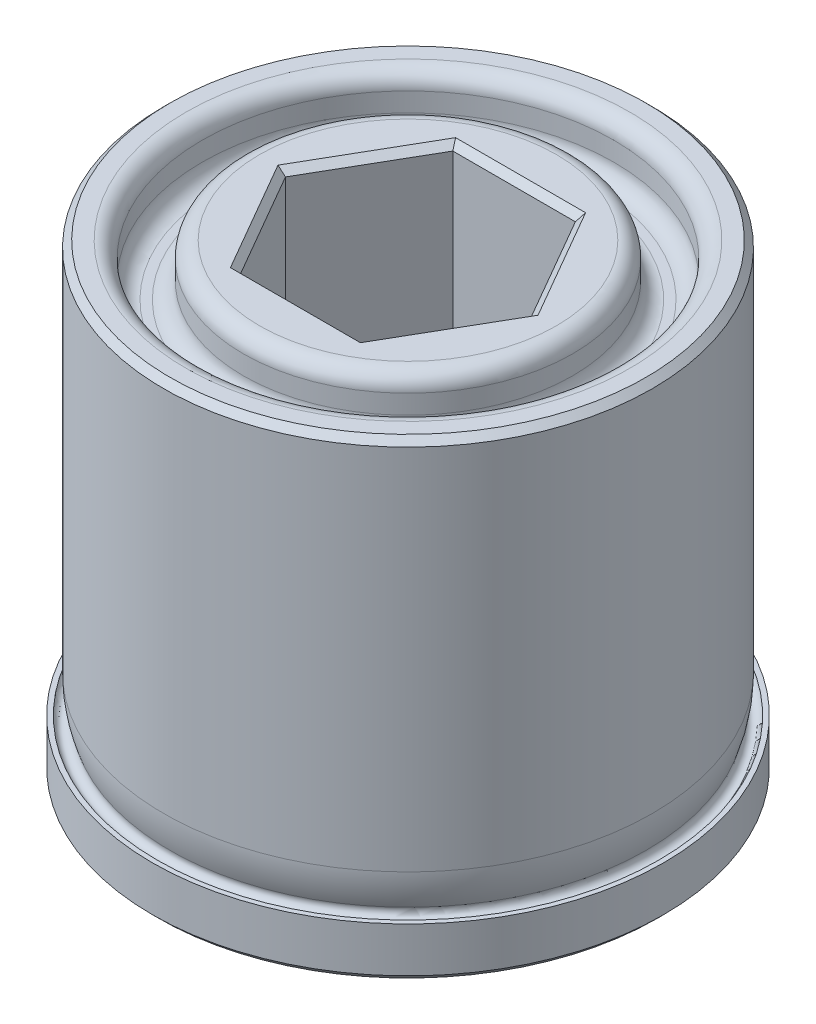
ISO-10303-21;
HEADER;
FILE_DESCRIPTION(('STEP AP214'),'2;1');
FILE_NAME('part.step','',(''),(''),'','','');
FILE_SCHEMA(('AUTOMOTIVE_DESIGN { 1 0 10303 214 1 1 1 1 }'));
ENDSEC;
DATA;
#1=APPLICATION_CONTEXT('core data for automotive mechanical design processes');
#2=APPLICATION_PROTOCOL_DEFINITION('international standard','automotive_design',2000,#1);
#3=PRODUCT_CONTEXT('',#1,'mechanical');
#4=PRODUCT('Part','Part','',(#3));
#5=PRODUCT_RELATED_PRODUCT_CATEGORY('part','',(#4));
#6=PRODUCT_DEFINITION_FORMATION('','',#4);
#7=PRODUCT_DEFINITION_CONTEXT('part definition',#1,'design');
#8=PRODUCT_DEFINITION('design','',#6,#7);
#9=PRODUCT_DEFINITION_SHAPE('','',#8);
#10=(LENGTH_UNIT() NAMED_UNIT(*) SI_UNIT(.MILLI.,.METRE.));
#11=(NAMED_UNIT(*) PLANE_ANGLE_UNIT() SI_UNIT($,.RADIAN.));
#12=(NAMED_UNIT(*) SI_UNIT($,.STERADIAN.) SOLID_ANGLE_UNIT());
#13=UNCERTAINTY_MEASURE_WITH_UNIT(LENGTH_MEASURE(1.E-05),#10,'distance_accuracy_value','');
#14=(GEOMETRIC_REPRESENTATION_CONTEXT(3) GLOBAL_UNCERTAINTY_ASSIGNED_CONTEXT((#13)) GLOBAL_UNIT_ASSIGNED_CONTEXT((#10,
#11,#12)) REPRESENTATION_CONTEXT('',''));
#15=CARTESIAN_POINT('',(0.,0.,0.));
#16=DIRECTION('',(0.,0.,1.));
#17=DIRECTION('',(1.,0.,0.));
#18=AXIS2_PLACEMENT_3D('',#15,#16,#17);
#19=CARTESIAN_POINT('',(0.,25.4,0.));
#20=DIRECTION('',(0.,1.,0.));
#21=DIRECTION('',(-1.,0.,0.));
#22=AXIS2_PLACEMENT_3D('',#19,#20,#21);
#23=PLANE('',#22);
#24=CARTESIAN_POINT('',(0.,25.4,0.));
#25=DIRECTION('',(0.,1.,0.));
#26=DIRECTION('',(-1.,0.,0.));
#27=AXIS2_PLACEMENT_3D('',#24,#25,#26);
#28=CIRCLE('',#27,9.16);
#29=CARTESIAN_POINT('',(-9.16,25.4,0.));
#30=VERTEX_POINT('',#29);
#31=EDGE_CURVE('E268',#30,#30,#28,.T.);
#32=ORIENTED_EDGE('',*,*,#31,.T.);
#33=EDGE_LOOP('',(#32));
#34=FACE_BOUND('',#33,.T.);
#35=DIRECTION('',(1.,0.,0.));
#36=VECTOR('',#35,1.);
#37=CARTESIAN_POINT('',(3.78164426319204,25.4,-6.95));
#38=LINE('',#37,#36);
#39=CARTESIAN_POINT('',(-4.0125843708679,25.4,-6.95));
#40=VERTEX_POINT('',#39);
#41=CARTESIAN_POINT('',(4.01258437086789,25.4,-6.95));
#42=VERTEX_POINT('',#41);
#43=EDGE_CURVE('E218',#40,#42,#38,.T.);
#44=ORIENTED_EDGE('',*,*,#43,.T.);
#45=DIRECTION('',(0.5,0.,0.866025403784439));
#46=VECTOR('',#45,1.);
#47=CARTESIAN_POINT('',(7.90969868789787,25.4,-0.200000000000005));
#48=LINE('',#47,#46);
#49=CARTESIAN_POINT('',(8.02516874173579,25.4,0.));
#50=VERTEX_POINT('',#49);
#51=EDGE_CURVE('E227',#42,#50,#48,.T.);
#52=ORIENTED_EDGE('',*,*,#51,.T.);
#53=DIRECTION('',(-0.5,0.,0.866025403784439));
#54=VECTOR('',#53,1.);
#55=CARTESIAN_POINT('',(4.12805442470582,25.4,6.75));
#56=LINE('',#55,#54);
#57=CARTESIAN_POINT('',(4.01258437086789,25.4,6.95));
#58=VERTEX_POINT('',#57);
#59=EDGE_CURVE('E55',#50,#58,#56,.T.);
#60=ORIENTED_EDGE('',*,*,#59,.T.);
#61=DIRECTION('',(-1.,0.,0.));
#62=VECTOR('',#61,1.);
#63=CARTESIAN_POINT('',(-3.78164426319205,25.4,6.95));
#64=LINE('',#63,#62);
#65=CARTESIAN_POINT('',(-4.0125843708679,25.4,6.95));
#66=VERTEX_POINT('',#65);
#67=EDGE_CURVE('E224',#58,#66,#64,.T.);
#68=ORIENTED_EDGE('',*,*,#67,.T.);
#69=DIRECTION('',(-0.5,0.,-0.866025403784439));
#70=VECTOR('',#69,1.);
#71=CARTESIAN_POINT('',(-7.90969868789788,25.4,0.200000000000001));
#72=LINE('',#71,#70);
#73=CARTESIAN_POINT('',(-8.0251687417358,25.4,0.));
#74=VERTEX_POINT('',#73);
#75=EDGE_CURVE('E222',#66,#74,#72,.T.);
#76=ORIENTED_EDGE('',*,*,#75,.T.);
#77=DIRECTION('',(0.5,0.,-0.866025403784439));
#78=VECTOR('',#77,1.);
#79=CARTESIAN_POINT('',(-4.12805442470583,25.4,-6.75));
#80=LINE('',#79,#78);
#81=EDGE_CURVE('E220',#74,#40,#80,.T.);
#82=ORIENTED_EDGE('',*,*,#81,.T.);
#83=EDGE_LOOP('',(#44,#52,#60,#68,#76,#82));
#84=FACE_BOUND('',#83,.T.);
#85=ADVANCED_FACE('F33',(#34,#84),#23,.T.);
#86=CARTESIAN_POINT('',(0.,-3.175,0.));
#87=DIRECTION('',(0.,-1.,0.));
#88=DIRECTION('',(1.,0.,0.));
#89=AXIS2_PLACEMENT_3D('',#86,#87,#88);
#90=PLANE('',#89);
#91=CARTESIAN_POINT('',(0.,-3.175,0.));
#92=DIRECTION('',(0.,-1.,0.));
#93=DIRECTION('',(1.,0.,0.));
#94=AXIS2_PLACEMENT_3D('',#91,#92,#93);
#95=CIRCLE('',#94,15.375);
#96=CARTESIAN_POINT('',(15.375,-3.175,0.));
#97=VERTEX_POINT('',#96);
#98=EDGE_CURVE('E228',#97,#97,#95,.T.);
#99=ORIENTED_EDGE('',*,*,#98,.T.);
#100=EDGE_LOOP('',(#99));
#101=FACE_BOUND('',#100,.T.);
#102=DIRECTION('',(1.,0.,0.));
#103=VECTOR('',#102,1.);
#104=CARTESIAN_POINT('',(3.78164426319205,-3.175,6.95000000000001));
#105=LINE('',#104,#103);
#106=CARTESIAN_POINT('',(-4.0125843708679,-3.175,6.95000000000001));
#107=VERTEX_POINT('',#106);
#108=CARTESIAN_POINT('',(4.0125843708679,-3.175,6.95000000000001));
#109=VERTEX_POINT('',#108);
#110=EDGE_CURVE('E198',#107,#109,#105,.T.);
#111=ORIENTED_EDGE('',*,*,#110,.T.);
#112=DIRECTION('',(0.5,0.,-0.866025403784439));
#113=VECTOR('',#112,1.);
#114=CARTESIAN_POINT('',(7.90969868789788,-3.175,0.199999999999997));
#115=LINE('',#114,#113);
#116=CARTESIAN_POINT('',(8.0251687417358,-3.175,0.));
#117=VERTEX_POINT('',#116);
#118=EDGE_CURVE('E131',#109,#117,#115,.T.);
#119=ORIENTED_EDGE('',*,*,#118,.T.);
#120=DIRECTION('',(-0.5,0.,-0.866025403784439));
#121=VECTOR('',#120,1.);
#122=CARTESIAN_POINT('',(4.12805442470583,-3.175,-6.75));
#123=LINE('',#122,#121);
#124=CARTESIAN_POINT('',(4.0125843708679,-3.175,-6.95000000000001));
#125=VERTEX_POINT('',#124);
#126=EDGE_CURVE('E192',#117,#125,#123,.T.);
#127=ORIENTED_EDGE('',*,*,#126,.T.);
#128=DIRECTION('',(-1.,0.,0.));
#129=VECTOR('',#128,1.);
#130=CARTESIAN_POINT('',(-3.78164426319205,-3.175,-6.95000000000001));
#131=LINE('',#130,#129);
#132=CARTESIAN_POINT('',(-4.0125843708679,-3.175,-6.95000000000001));
#133=VERTEX_POINT('',#132);
#134=EDGE_CURVE('E158',#125,#133,#131,.T.);
#135=ORIENTED_EDGE('',*,*,#134,.T.);
#136=DIRECTION('',(-0.5,0.,0.866025403784439));
#137=VECTOR('',#136,1.);
#138=CARTESIAN_POINT('',(-7.90969868789788,-3.175,-0.200000000000001));
#139=LINE('',#138,#137);
#140=CARTESIAN_POINT('',(-8.0251687417358,-3.175,0.));
#141=VERTEX_POINT('',#140);
#142=EDGE_CURVE('E194',#133,#141,#139,.T.);
#143=ORIENTED_EDGE('',*,*,#142,.T.);
#144=DIRECTION('',(0.5,0.,0.866025403784439));
#145=VECTOR('',#144,1.);
#146=CARTESIAN_POINT('',(-4.12805442470583,-3.175,6.75));
#147=LINE('',#146,#145);
#148=EDGE_CURVE('E196',#141,#107,#147,.T.);
#149=ORIENTED_EDGE('',*,*,#148,.T.);
#150=EDGE_LOOP('',(#111,#119,#127,#135,#143,#149));
#151=FACE_BOUND('',#150,.T.);
#152=ADVANCED_FACE('F298',(#101,#151),#90,.T.);
#153=CARTESIAN_POINT('',(0.,0.,0.));
#154=DIRECTION('',(0.,-1.,0.));
#155=DIRECTION('',(1.,0.,0.));
#156=AXIS2_PLACEMENT_3D('',#153,#154,#155);
#157=CYLINDRICAL_SURFACE('',#156,15.775);
#158=CARTESIAN_POINT('',(0.,-2.77499999999999,0.));
#159=DIRECTION('',(0.,-1.,0.));
#160=DIRECTION('',(1.,0.,0.));
#161=AXIS2_PLACEMENT_3D('',#158,#159,#160);
#162=CIRCLE('',#161,15.775);
#163=CARTESIAN_POINT('',(15.775,-2.77499999999999,0.));
#164=VERTEX_POINT('',#163);
#165=EDGE_CURVE('E256',#164,#164,#162,.F.);
#166=ORIENTED_EDGE('',*,*,#165,.T.);
#167=EDGE_LOOP('',(#166));
#168=FACE_BOUND('',#167,.T.);
#169=CARTESIAN_POINT('',(0.,0.,0.));
#170=DIRECTION('',(0.,-1.,0.));
#171=DIRECTION('',(1.,0.,0.));
#172=AXIS2_PLACEMENT_3D('',#169,#170,#171);
#173=CIRCLE('',#172,15.775);
#174=CARTESIAN_POINT('',(15.775,0.,0.));
#175=VERTEX_POINT('',#174);
#176=EDGE_CURVE('E167',#175,#175,#173,.T.);
#177=ORIENTED_EDGE('',*,*,#176,.T.);
#178=EDGE_LOOP('',(#177));
#179=FACE_BOUND('',#178,.T.);
#180=ADVANCED_FACE('F305',(#168,#179),#157,.T.);
#181=CARTESIAN_POINT('',(15.481250054,0.,0.));
#182=DIRECTION('',(0.,1.,0.));
#183=DIRECTION('',(-1.,0.,0.));
#184=AXIS2_PLACEMENT_3D('',#181,#182,#183);
#185=PLANE('',#184);
#186=CARTESIAN_POINT('',(0.,0.,0.));
#187=DIRECTION('',(0.,-1.,0.));
#188=DIRECTION('',(1.,0.,0.));
#189=AXIS2_PLACEMENT_3D('',#186,#187,#188);
#190=CIRCLE('',#189,15.481250054);
#191=CARTESIAN_POINT('',(15.481250054,0.,0.));
#192=VERTEX_POINT('',#191);
#193=EDGE_CURVE('E163',#192,#192,#190,.T.);
#194=ORIENTED_EDGE('',*,*,#193,.T.);
#195=EDGE_LOOP('',(#194));
#196=FACE_BOUND('',#195,.T.);
#197=ORIENTED_EDGE('',*,*,#176,.F.);
#198=EDGE_LOOP('',(#197));
#199=FACE_BOUND('',#198,.T.);
#200=ADVANCED_FACE('F554',(#196,#199),#185,.T.);
#201=CARTESIAN_POINT('',(0.,0.,0.));
#202=DIRECTION('',(0.,-1.,0.));
#203=DIRECTION('',(1.,0.,0.));
#204=AXIS2_PLACEMENT_3D('',#201,#202,#203);
#205=TOROIDAL_SURFACE('',#204,15.081250054,0.4);
#206=CARTESIAN_POINT('',(0.,0.13565064464904,0.));
#207=DIRECTION('',(0.,-1.,0.));
#208=DIRECTION('',(1.,0.,0.));
#209=AXIS2_PLACEMENT_3D('',#206,#207,#208);
#210=CIRCLE('',#209,14.7049537577036);
#211=CARTESIAN_POINT('',(14.7049537577036,0.135650644649043,0.));
#212=VERTEX_POINT('',#211);
#213=EDGE_CURVE('E41',#212,#212,#210,.T.);
#214=ORIENTED_EDGE('',*,*,#213,.T.);
#215=EDGE_LOOP('',(#214));
#216=FACE_BOUND('',#215,.T.);
#217=ORIENTED_EDGE('',*,*,#193,.F.);
#218=EDGE_LOOP('',(#217));
#219=FACE_BOUND('',#218,.T.);
#220=ADVANCED_FACE('F285',(#216,#219),#205,.F.);
#221=CARTESIAN_POINT('',(0.,0.,0.));
#222=DIRECTION('',(0.,-1.,0.));
#223=DIRECTION('',(1.,0.,0.));
#224=AXIS2_PLACEMENT_3D('',#221,#222,#223);
#225=CYLINDRICAL_SURFACE('',#224,15.081250054);
#226=CARTESIAN_POINT('',(0.,2.28910462845201,0.));
#227=DIRECTION('',(0.,1.,0.));
#228=DIRECTION('',(-1.,0.,0.));
#229=AXIS2_PLACEMENT_3D('',#226,#227,#228);
#230=CIRCLE('',#229,15.081250054);
#231=CARTESIAN_POINT('',(-15.081250054,2.28910462845201,0.));
#232=VERTEX_POINT('',#231);
#233=EDGE_CURVE('E11',#232,#232,#230,.T.);
#234=ORIENTED_EDGE('',*,*,#233,.T.);
#235=EDGE_LOOP('',(#234));
#236=FACE_BOUND('',#235,.T.);
#237=CARTESIAN_POINT('',(0.,25.,0.));
#238=DIRECTION('',(0.,1.,0.));
#239=DIRECTION('',(-1.,0.,0.));
#240=AXIS2_PLACEMENT_3D('',#237,#238,#239);
#241=CIRCLE('',#240,15.081250054);
#242=CARTESIAN_POINT('',(-15.081250054,25.,0.));
#243=VERTEX_POINT('',#242);
#244=EDGE_CURVE('E184',#243,#243,#241,.F.);
#245=ORIENTED_EDGE('',*,*,#244,.T.);
#246=EDGE_LOOP('',(#245));
#247=FACE_BOUND('',#246,.T.);
#248=ADVANCED_FACE('F312',(#236,#247),#225,.T.);
#249=CARTESIAN_POINT('',(0.,25.4,0.));
#250=DIRECTION('',(0.,1.,0.));
#251=DIRECTION('',(-1.,0.,0.));
#252=AXIS2_PLACEMENT_3D('',#249,#250,#251);
#253=CIRCLE('',#252,13.7);
#254=CARTESIAN_POINT('',(-13.7,25.4,0.));
#255=VERTEX_POINT('',#254);
#256=EDGE_CURVE('E265',#255,#255,#253,.F.);
#257=ORIENTED_EDGE('',*,*,#256,.T.);
#258=EDGE_LOOP('',(#257));
#259=FACE_BOUND('',#258,.T.);
#260=CARTESIAN_POINT('',(0.,25.4,0.));
#261=DIRECTION('',(0.,1.,0.));
#262=DIRECTION('',(-1.,0.,0.));
#263=AXIS2_PLACEMENT_3D('',#260,#261,#262);
#264=CIRCLE('',#263,14.681250054);
#265=CARTESIAN_POINT('',(-14.681250054,25.4,0.));
#266=VERTEX_POINT('',#265);
#267=EDGE_CURVE('E187',#266,#266,#264,.T.);
#268=ORIENTED_EDGE('',*,*,#267,.T.);
#269=EDGE_LOOP('',(#268));
#270=FACE_BOUND('',#269,.T.);
#271=ADVANCED_FACE('F301',(#259,#270),#23,.T.);
#272=CARTESIAN_POINT('',(0.,25.,0.));
#273=DIRECTION('',(0.,-1.,0.));
#274=DIRECTION('',(1.,0.,0.));
#275=AXIS2_PLACEMENT_3D('',#272,#273,#274);
#276=CONICAL_SURFACE('',#275,15.081250054,0.785398163397453);
#277=ORIENTED_EDGE('',*,*,#267,.F.);
#278=EDGE_LOOP('',(#277));
#279=FACE_BOUND('',#278,.T.);
#280=ORIENTED_EDGE('',*,*,#244,.F.);
#281=EDGE_LOOP('',(#280));
#282=FACE_BOUND('',#281,.T.);
#283=ADVANCED_FACE('F311',(#279,#282),#276,.T.);
#284=CARTESIAN_POINT('',(3.78164426319205,-12.7,6.55));
#285=DIRECTION('',(0.866025403784439,0.,0.5));
#286=DIRECTION('',(0.5,0.,-0.866025403784439));
#287=AXIS2_PLACEMENT_3D('',#284,#285,#286);
#288=PLANE('',#287);
#289=DIRECTION('',(0.,1.,0.));
#290=VECTOR('',#289,1.);
#291=CARTESIAN_POINT('',(7.5632885263841,-12.7,0.));
#292=LINE('',#291,#290);
#293=CARTESIAN_POINT('',(7.5632885263841,-2.775,0.));
#294=VERTEX_POINT('',#293);
#295=CARTESIAN_POINT('',(7.56328852638409,25.,0.));
#296=VERTEX_POINT('',#295);
#297=EDGE_CURVE('E156',#294,#296,#292,.T.);
#298=ORIENTED_EDGE('',*,*,#297,.F.);
#299=DIRECTION('',(-0.5,0.,0.866025403784439));
#300=VECTOR('',#299,1.);
#301=CARTESIAN_POINT('',(3.78164426319205,-2.775,6.55));
#302=LINE('',#301,#300);
#303=CARTESIAN_POINT('',(3.78164426319205,-2.775,6.55));
#304=VERTEX_POINT('',#303);
#305=EDGE_CURVE('E129',#294,#304,#302,.T.);
#306=ORIENTED_EDGE('',*,*,#305,.T.);
#307=DIRECTION('',(0.,1.,0.));
#308=VECTOR('',#307,1.);
#309=CARTESIAN_POINT('',(3.78164426319205,-12.7,6.55));
#310=LINE('',#309,#308);
#311=CARTESIAN_POINT('',(3.78164426319204,25.,6.55));
#312=VERTEX_POINT('',#311);
#313=EDGE_CURVE('E153',#304,#312,#310,.T.);
#314=ORIENTED_EDGE('',*,*,#313,.T.);
#315=DIRECTION('',(0.5,0.,-0.866025403784439));
#316=VECTOR('',#315,1.);
#317=CARTESIAN_POINT('',(7.56328852638409,25.,0.));
#318=LINE('',#317,#316);
#319=EDGE_CURVE('E159',#312,#296,#318,.T.);
#320=ORIENTED_EDGE('',*,*,#319,.T.);
#321=EDGE_LOOP('',(#298,#306,#314,#320));
#322=FACE_BOUND('',#321,.T.);
#323=ADVANCED_FACE('F152',(#322),#288,.F.);
#324=CARTESIAN_POINT('',(-3.78164426319205,-12.7,6.55));
#325=DIRECTION('',(0.,0.,1.));
#326=DIRECTION('',(1.,0.,0.));
#327=AXIS2_PLACEMENT_3D('',#324,#325,#326);
#328=PLANE('',#327);
#329=ORIENTED_EDGE('',*,*,#313,.F.);
#330=DIRECTION('',(-1.,0.,0.));
#331=VECTOR('',#330,1.);
#332=CARTESIAN_POINT('',(-3.78164426319205,-2.775,6.55));
#333=LINE('',#332,#331);
#334=CARTESIAN_POINT('',(-3.78164426319205,-2.775,6.55));
#335=VERTEX_POINT('',#334);
#336=EDGE_CURVE('E138',#304,#335,#333,.T.);
#337=ORIENTED_EDGE('',*,*,#336,.T.);
#338=DIRECTION('',(0.,1.,0.));
#339=VECTOR('',#338,1.);
#340=CARTESIAN_POINT('',(-3.78164426319205,-12.7,6.55));
#341=LINE('',#340,#339);
#342=CARTESIAN_POINT('',(-3.78164426319205,25.,6.55));
#343=VERTEX_POINT('',#342);
#344=EDGE_CURVE('E164',#335,#343,#341,.T.);
#345=ORIENTED_EDGE('',*,*,#344,.T.);
#346=DIRECTION('',(1.,0.,0.));
#347=VECTOR('',#346,1.);
#348=CARTESIAN_POINT('',(3.78164426319204,25.,6.55));
#349=LINE('',#348,#347);
#350=EDGE_CURVE('E147',#343,#312,#349,.T.);
#351=ORIENTED_EDGE('',*,*,#350,.T.);
#352=EDGE_LOOP('',(#329,#337,#345,#351));
#353=FACE_BOUND('',#352,.T.);
#354=ADVANCED_FACE('F161',(#353),#328,.F.);
#355=CARTESIAN_POINT('',(-7.56328852638409,-12.7,0.));
#356=DIRECTION('',(-0.866025403784439,0.,0.5));
#357=DIRECTION('',(0.5,0.,0.866025403784439));
#358=AXIS2_PLACEMENT_3D('',#355,#356,#357);
#359=PLANE('',#358);
#360=ORIENTED_EDGE('',*,*,#344,.F.);
#361=DIRECTION('',(-0.5,0.,-0.866025403784439));
#362=VECTOR('',#361,1.);
#363=CARTESIAN_POINT('',(-7.5632885263841,-2.775,0.));
#364=LINE('',#363,#362);
#365=CARTESIAN_POINT('',(-7.5632885263841,-2.775,0.));
#366=VERTEX_POINT('',#365);
#367=EDGE_CURVE('E203',#335,#366,#364,.T.);
#368=ORIENTED_EDGE('',*,*,#367,.T.);
#369=DIRECTION('',(0.,1.,0.));
#370=VECTOR('',#369,1.);
#371=CARTESIAN_POINT('',(-7.56328852638409,-12.7,0.));
#372=LINE('',#371,#370);
#373=CARTESIAN_POINT('',(-7.5632885263841,25.,0.));
#374=VERTEX_POINT('',#373);
#375=EDGE_CURVE('E169',#366,#374,#372,.T.);
#376=ORIENTED_EDGE('',*,*,#375,.T.);
#377=DIRECTION('',(0.5,0.,0.866025403784439));
#378=VECTOR('',#377,1.);
#379=CARTESIAN_POINT('',(-3.78164426319205,25.,6.55));
#380=LINE('',#379,#378);
#381=EDGE_CURVE('E146',#374,#343,#380,.T.);
#382=ORIENTED_EDGE('',*,*,#381,.T.);
#383=EDGE_LOOP('',(#360,#368,#376,#382));
#384=FACE_BOUND('',#383,.T.);
#385=ADVANCED_FACE('F357',(#384),#359,.F.);
#386=CARTESIAN_POINT('',(-3.78164426319205,-12.7,-6.55));
#387=DIRECTION('',(-0.866025403784439,0.,-0.5));
#388=DIRECTION('',(-0.5,0.,0.866025403784439));
#389=AXIS2_PLACEMENT_3D('',#386,#387,#388);
#390=PLANE('',#389);
#391=ORIENTED_EDGE('',*,*,#375,.F.);
#392=DIRECTION('',(0.5,0.,-0.866025403784439));
#393=VECTOR('',#392,1.);
#394=CARTESIAN_POINT('',(-3.78164426319205,-2.775,-6.55));
#395=LINE('',#394,#393);
#396=CARTESIAN_POINT('',(-3.78164426319205,-2.775,-6.55));
#397=VERTEX_POINT('',#396);
#398=EDGE_CURVE('E207',#366,#397,#395,.T.);
#399=ORIENTED_EDGE('',*,*,#398,.T.);
#400=DIRECTION('',(0.,1.,0.));
#401=VECTOR('',#400,1.);
#402=CARTESIAN_POINT('',(-3.78164426319205,-12.7,-6.55));
#403=LINE('',#402,#401);
#404=CARTESIAN_POINT('',(-3.78164426319206,25.,-6.55));
#405=VERTEX_POINT('',#404);
#406=EDGE_CURVE('E174',#397,#405,#403,.T.);
#407=ORIENTED_EDGE('',*,*,#406,.T.);
#408=DIRECTION('',(-0.5,0.,0.866025403784439));
#409=VECTOR('',#408,1.);
#410=CARTESIAN_POINT('',(-7.5632885263841,25.,0.));
#411=LINE('',#410,#409);
#412=EDGE_CURVE('E205',#405,#374,#411,.T.);
#413=ORIENTED_EDGE('',*,*,#412,.T.);
#414=EDGE_LOOP('',(#391,#399,#407,#413));
#415=FACE_BOUND('',#414,.T.);
#416=ADVANCED_FACE('F360',(#415),#390,.F.);
#417=CARTESIAN_POINT('',(3.78164426319205,-12.7,-6.55));
#418=DIRECTION('',(0.,0.,-1.));
#419=DIRECTION('',(-1.,0.,0.));
#420=AXIS2_PLACEMENT_3D('',#417,#418,#419);
#421=PLANE('',#420);
#422=ORIENTED_EDGE('',*,*,#406,.F.);
#423=DIRECTION('',(1.,0.,0.));
#424=VECTOR('',#423,1.);
#425=CARTESIAN_POINT('',(3.78164426319205,-2.775,-6.55));
#426=LINE('',#425,#424);
#427=CARTESIAN_POINT('',(3.78164426319205,-2.775,-6.55));
#428=VERTEX_POINT('',#427);
#429=EDGE_CURVE('E216',#397,#428,#426,.T.);
#430=ORIENTED_EDGE('',*,*,#429,.T.);
#431=DIRECTION('',(0.,1.,0.));
#432=VECTOR('',#431,1.);
#433=CARTESIAN_POINT('',(3.78164426319205,-12.7,-6.55));
#434=LINE('',#433,#432);
#435=CARTESIAN_POINT('',(3.78164426319204,25.,-6.55));
#436=VERTEX_POINT('',#435);
#437=EDGE_CURVE('E177',#428,#436,#434,.T.);
#438=ORIENTED_EDGE('',*,*,#437,.T.);
#439=DIRECTION('',(-1.,0.,0.));
#440=VECTOR('',#439,1.);
#441=CARTESIAN_POINT('',(-3.78164426319206,25.,-6.55));
#442=LINE('',#441,#440);
#443=EDGE_CURVE('E214',#436,#405,#442,.T.);
#444=ORIENTED_EDGE('',*,*,#443,.T.);
#445=EDGE_LOOP('',(#422,#430,#438,#444));
#446=FACE_BOUND('',#445,.T.);
#447=ADVANCED_FACE('F364',(#446),#421,.F.);
#448=CARTESIAN_POINT('',(7.5632885263841,-12.7,0.));
#449=DIRECTION('',(0.866025403784439,0.,-0.5));
#450=DIRECTION('',(-0.5,0.,-0.866025403784438));
#451=AXIS2_PLACEMENT_3D('',#448,#449,#450);
#452=PLANE('',#451);
#453=ORIENTED_EDGE('',*,*,#437,.F.);
#454=DIRECTION('',(0.5,0.,0.866025403784438));
#455=VECTOR('',#454,1.);
#456=CARTESIAN_POINT('',(7.5632885263841,-2.77499999999999,0.));
#457=LINE('',#456,#455);
#458=EDGE_CURVE('E212',#428,#294,#457,.T.);
#459=ORIENTED_EDGE('',*,*,#458,.T.);
#460=ORIENTED_EDGE('',*,*,#297,.T.);
#461=DIRECTION('',(-0.5,0.,-0.866025403784438));
#462=VECTOR('',#461,1.);
#463=CARTESIAN_POINT('',(3.78164426319204,25.,-6.55));
#464=LINE('',#463,#462);
#465=EDGE_CURVE('E209',#296,#436,#464,.T.);
#466=ORIENTED_EDGE('',*,*,#465,.T.);
#467=EDGE_LOOP('',(#453,#459,#460,#466));
#468=FACE_BOUND('',#467,.T.);
#469=ADVANCED_FACE('F368',(#468),#452,.F.);
#470=CARTESIAN_POINT('',(-3.78164426319205,-2.775,-6.55));
#471=DIRECTION('',(0.612372435695796,-0.707106781186546,0.353553390593274));
#472=DIRECTION('',(-0.5,0.,0.866025403784439));
#473=AXIS2_PLACEMENT_3D('',#470,#471,#472);
#474=PLANE('',#473);
#475=DIRECTION('',(-0.755928946018454,-0.654653670707978,0.));
#476=VECTOR('',#475,1.);
#477=CARTESIAN_POINT('',(-7.5632885263841,-2.775,0.));
#478=LINE('',#477,#476);
#479=EDGE_CURVE('E235',#141,#366,#478,.F.);
#480=ORIENTED_EDGE('',*,*,#479,.F.);
#481=ORIENTED_EDGE('',*,*,#142,.F.);
#482=DIRECTION('',(-0.377964473009224,-0.654653670707977,-0.654653670707979));
#483=VECTOR('',#482,1.);
#484=CARTESIAN_POINT('',(-3.78164426319205,-2.775,-6.55));
#485=LINE('',#484,#483);
#486=EDGE_CURVE('E180',#397,#133,#485,.T.);
#487=ORIENTED_EDGE('',*,*,#486,.F.);
#488=ORIENTED_EDGE('',*,*,#398,.F.);
#489=EDGE_LOOP('',(#480,#481,#487,#488));
#490=FACE_BOUND('',#489,.T.);
#491=ADVANCED_FACE('F371',(#490),#474,.T.);
#492=CARTESIAN_POINT('',(3.78164426319205,-2.775,-6.55));
#493=DIRECTION('',(0.,-0.707106781186548,0.707106781186547));
#494=DIRECTION('',(-1.,0.,0.));
#495=AXIS2_PLACEMENT_3D('',#492,#493,#494);
#496=PLANE('',#495);
#497=ORIENTED_EDGE('',*,*,#486,.T.);
#498=ORIENTED_EDGE('',*,*,#134,.F.);
#499=DIRECTION('',(-0.377964473009224,0.654653670707977,0.654653670707979));
#500=VECTOR('',#499,1.);
#501=CARTESIAN_POINT('',(2.70117447370861,-0.903571428571412,-4.67857142857141));
#502=LINE('',#501,#500);
#503=EDGE_CURVE('E232',#428,#125,#502,.F.);
#504=ORIENTED_EDGE('',*,*,#503,.F.);
#505=ORIENTED_EDGE('',*,*,#429,.F.);
#506=EDGE_LOOP('',(#497,#498,#504,#505));
#507=FACE_BOUND('',#506,.T.);
#508=ADVANCED_FACE('F404',(#507),#496,.T.);
#509=CARTESIAN_POINT('',(-7.5632885263841,-2.775,0.));
#510=DIRECTION('',(0.612372435695794,-0.707106781186547,-0.353553390593274));
#511=DIRECTION('',(0.5,0.,0.866025403784439));
#512=AXIS2_PLACEMENT_3D('',#509,#510,#511);
#513=PLANE('',#512);
#514=ORIENTED_EDGE('',*,*,#479,.T.);
#515=ORIENTED_EDGE('',*,*,#367,.F.);
#516=DIRECTION('',(-0.377964473009227,-0.654653670707977,0.654653670707977));
#517=VECTOR('',#516,1.);
#518=CARTESIAN_POINT('',(-3.78164426319205,-2.775,6.55));
#519=LINE('',#518,#517);
#520=EDGE_CURVE('E141',#107,#335,#519,.F.);
#521=ORIENTED_EDGE('',*,*,#520,.F.);
#522=ORIENTED_EDGE('',*,*,#148,.F.);
#523=EDGE_LOOP('',(#514,#515,#521,#522));
#524=FACE_BOUND('',#523,.T.);
#525=ADVANCED_FACE('F412',(#524),#513,.T.);
#526=CARTESIAN_POINT('',(7.5632885263841,-2.77499999999999,0.));
#527=DIRECTION('',(-0.612372435695795,-0.707106781186547,0.353553390593275));
#528=DIRECTION('',(-0.5,0.,-0.866025403784438));
#529=AXIS2_PLACEMENT_3D('',#526,#527,#528);
#530=PLANE('',#529);
#531=ORIENTED_EDGE('',*,*,#503,.T.);
#532=ORIENTED_EDGE('',*,*,#126,.F.);
#533=DIRECTION('',(-0.755928946018454,0.654653670707977,0.));
#534=VECTOR('',#533,1.);
#535=CARTESIAN_POINT('',(5.40234894741723,-0.903571428571437,0.));
#536=LINE('',#535,#534);
#537=EDGE_CURVE('E134',#294,#117,#536,.F.);
#538=ORIENTED_EDGE('',*,*,#537,.F.);
#539=ORIENTED_EDGE('',*,*,#458,.F.);
#540=EDGE_LOOP('',(#531,#532,#538,#539));
#541=FACE_BOUND('',#540,.T.);
#542=ADVANCED_FACE('F420',(#541),#530,.T.);
#543=CARTESIAN_POINT('',(-3.78164426319205,-2.775,6.55));
#544=DIRECTION('',(0.,-0.707106781186548,-0.707106781186547));
#545=DIRECTION('',(1.,0.,0.));
#546=AXIS2_PLACEMENT_3D('',#543,#544,#545);
#547=PLANE('',#546);
#548=ORIENTED_EDGE('',*,*,#520,.T.);
#549=ORIENTED_EDGE('',*,*,#336,.F.);
#550=DIRECTION('',(0.377964473009228,-0.654653670707977,0.654653670707977));
#551=VECTOR('',#550,1.);
#552=CARTESIAN_POINT('',(3.78164426319205,-2.775,6.55));
#553=LINE('',#552,#551);
#554=EDGE_CURVE('E125',#109,#304,#553,.F.);
#555=ORIENTED_EDGE('',*,*,#554,.F.);
#556=ORIENTED_EDGE('',*,*,#110,.F.);
#557=EDGE_LOOP('',(#548,#549,#555,#556));
#558=FACE_BOUND('',#557,.T.);
#559=ADVANCED_FACE('F139',(#558),#547,.T.);
#560=CARTESIAN_POINT('',(3.78164426319205,-2.775,6.55));
#561=DIRECTION('',(-0.612372435695794,-0.707106781186548,-0.353553390593273));
#562=DIRECTION('',(0.5,0.,-0.866025403784439));
#563=AXIS2_PLACEMENT_3D('',#560,#561,#562);
#564=PLANE('',#563);
#565=ORIENTED_EDGE('',*,*,#537,.T.);
#566=ORIENTED_EDGE('',*,*,#118,.F.);
#567=ORIENTED_EDGE('',*,*,#554,.T.);
#568=ORIENTED_EDGE('',*,*,#305,.F.);
#569=EDGE_LOOP('',(#565,#566,#567,#568));
#570=FACE_BOUND('',#569,.T.);
#571=ADVANCED_FACE('F127',(#570),#564,.T.);
#572=CARTESIAN_POINT('',(-7.5632885263841,25.,0.));
#573=DIRECTION('',(0.612372435695793,0.707106781186549,-0.353553390593273));
#574=DIRECTION('',(-0.5,0.,-0.866025403784439));
#575=AXIS2_PLACEMENT_3D('',#572,#573,#574);
#576=PLANE('',#575);
#577=DIRECTION('',(0.755928946018455,-0.654653670707977,0.));
#578=VECTOR('',#577,1.);
#579=CARTESIAN_POINT('',(-7.5632885263841,25.,0.));
#580=LINE('',#579,#578);
#581=EDGE_CURVE('E249',#74,#374,#580,.T.);
#582=ORIENTED_EDGE('',*,*,#581,.F.);
#583=ORIENTED_EDGE('',*,*,#75,.F.);
#584=DIRECTION('',(0.377964473009229,-0.654653670707977,-0.654653670707977));
#585=VECTOR('',#584,1.);
#586=CARTESIAN_POINT('',(-3.78164426319205,25.,6.55));
#587=LINE('',#586,#585);
#588=EDGE_CURVE('E135',#343,#66,#587,.F.);
#589=ORIENTED_EDGE('',*,*,#588,.F.);
#590=ORIENTED_EDGE('',*,*,#381,.F.);
#591=EDGE_LOOP('',(#582,#583,#589,#590));
#592=FACE_BOUND('',#591,.T.);
#593=ADVANCED_FACE('F441',(#592),#576,.T.);
#594=CARTESIAN_POINT('',(-3.78164426319205,25.,6.55));
#595=DIRECTION('',(0.,0.707106781186548,-0.707106781186547));
#596=DIRECTION('',(-1.,0.,0.));
#597=AXIS2_PLACEMENT_3D('',#594,#595,#596);
#598=PLANE('',#597);
#599=ORIENTED_EDGE('',*,*,#588,.T.);
#600=ORIENTED_EDGE('',*,*,#67,.F.);
#601=DIRECTION('',(-0.377964473009229,-0.654653670707977,-0.654653670707977));
#602=VECTOR('',#601,1.);
#603=CARTESIAN_POINT('',(3.78164426319204,25.,6.55));
#604=LINE('',#603,#602);
#605=EDGE_CURVE('E246',#312,#58,#604,.F.);
#606=ORIENTED_EDGE('',*,*,#605,.F.);
#607=ORIENTED_EDGE('',*,*,#350,.F.);
#608=EDGE_LOOP('',(#599,#600,#606,#607));
#609=FACE_BOUND('',#608,.T.);
#610=ADVANCED_FACE('F448',(#609),#598,.T.);
#611=CARTESIAN_POINT('',(-3.78164426319206,25.,-6.55));
#612=DIRECTION('',(0.612372435695796,0.707106781186547,0.353553390593274));
#613=DIRECTION('',(0.5,0.,-0.866025403784439));
#614=AXIS2_PLACEMENT_3D('',#611,#612,#613);
#615=PLANE('',#614);
#616=ORIENTED_EDGE('',*,*,#581,.T.);
#617=ORIENTED_EDGE('',*,*,#412,.F.);
#618=DIRECTION('',(0.377964473009226,-0.654653670707978,0.654653670707977));
#619=VECTOR('',#618,1.);
#620=CARTESIAN_POINT('',(-3.78164426319205,25.,-6.55));
#621=LINE('',#620,#619);
#622=EDGE_CURVE('E243',#40,#405,#621,.T.);
#623=ORIENTED_EDGE('',*,*,#622,.F.);
#624=ORIENTED_EDGE('',*,*,#81,.F.);
#625=EDGE_LOOP('',(#616,#617,#623,#624));
#626=FACE_BOUND('',#625,.T.);
#627=ADVANCED_FACE('F456',(#626),#615,.T.);
#628=CARTESIAN_POINT('',(3.78164426319204,25.,6.55));
#629=DIRECTION('',(-0.612372435695794,0.707106781186548,-0.353553390593273));
#630=DIRECTION('',(-0.5,0.,0.866025403784439));
#631=AXIS2_PLACEMENT_3D('',#628,#629,#630);
#632=PLANE('',#631);
#633=ORIENTED_EDGE('',*,*,#605,.T.);
#634=ORIENTED_EDGE('',*,*,#59,.F.);
#635=DIRECTION('',(-0.755928946018455,-0.654653670707976,0.));
#636=VECTOR('',#635,1.);
#637=CARTESIAN_POINT('',(7.56328852638409,25.,0.));
#638=LINE('',#637,#636);
#639=EDGE_CURVE('E48',#296,#50,#638,.F.);
#640=ORIENTED_EDGE('',*,*,#639,.F.);
#641=ORIENTED_EDGE('',*,*,#319,.F.);
#642=EDGE_LOOP('',(#633,#634,#640,#641));
#643=FACE_BOUND('',#642,.T.);
#644=ADVANCED_FACE('F464',(#643),#632,.T.);
#645=CARTESIAN_POINT('',(3.78164426319204,25.,-6.55));
#646=DIRECTION('',(0.,0.707106781186547,0.707106781186548));
#647=DIRECTION('',(1.,0.,0.));
#648=AXIS2_PLACEMENT_3D('',#645,#646,#647);
#649=PLANE('',#648);
#650=ORIENTED_EDGE('',*,*,#622,.T.);
#651=ORIENTED_EDGE('',*,*,#443,.F.);
#652=DIRECTION('',(0.377964473009229,0.654653670707977,-0.654653670707976));
#653=VECTOR('',#652,1.);
#654=CARTESIAN_POINT('',(2.7011744737086,23.1285714285714,-4.67857142857144));
#655=LINE('',#654,#653);
#656=EDGE_CURVE('E240',#42,#436,#655,.F.);
#657=ORIENTED_EDGE('',*,*,#656,.F.);
#658=ORIENTED_EDGE('',*,*,#43,.F.);
#659=EDGE_LOOP('',(#650,#651,#657,#658));
#660=FACE_BOUND('',#659,.T.);
#661=ADVANCED_FACE('F472',(#660),#649,.T.);
#662=CARTESIAN_POINT('',(7.56328852638409,25.,0.));
#663=DIRECTION('',(-0.612372435695794,0.707106781186548,0.353553390593274));
#664=DIRECTION('',(0.5,0.,0.866025403784438));
#665=AXIS2_PLACEMENT_3D('',#662,#663,#664);
#666=PLANE('',#665);
#667=ORIENTED_EDGE('',*,*,#639,.T.);
#668=ORIENTED_EDGE('',*,*,#51,.F.);
#669=ORIENTED_EDGE('',*,*,#656,.T.);
#670=ORIENTED_EDGE('',*,*,#465,.F.);
#671=EDGE_LOOP('',(#667,#668,#669,#670));
#672=FACE_BOUND('',#671,.T.);
#673=ADVANCED_FACE('F480',(#672),#666,.T.);
#674=CARTESIAN_POINT('',(0.,-3.175,0.));
#675=DIRECTION('',(0.,1.,0.));
#676=DIRECTION('',(-1.,0.,0.));
#677=AXIS2_PLACEMENT_3D('',#674,#675,#676);
#678=CONICAL_SURFACE('',#677,15.375,0.785398163397448);
#679=ORIENTED_EDGE('',*,*,#165,.F.);
#680=EDGE_LOOP('',(#679));
#681=FACE_BOUND('',#680,.T.);
#682=ORIENTED_EDGE('',*,*,#98,.F.);
#683=EDGE_LOOP('',(#682));
#684=FACE_BOUND('',#683,.T.);
#685=ADVANCED_FACE('F340',(#681,#684),#678,.T.);
#686=CARTESIAN_POINT('',(0.,22.225,0.));
#687=DIRECTION('',(0.,1.,0.));
#688=DIRECTION('',(-1.,0.,0.));
#689=AXIS2_PLACEMENT_3D('',#686,#687,#688);
#690=CYLINDRICAL_SURFACE('',#689,12.7);
#691=CARTESIAN_POINT('',(0.,24.4,0.));
#692=DIRECTION('',(0.,1.,0.));
#693=DIRECTION('',(-1.,0.,0.));
#694=AXIS2_PLACEMENT_3D('',#691,#692,#693);
#695=CIRCLE('',#694,12.7);
#696=CARTESIAN_POINT('',(-12.7,24.4,0.));
#697=VERTEX_POINT('',#696);
#698=EDGE_CURVE('E262',#697,#697,#695,.T.);
#699=ORIENTED_EDGE('',*,*,#698,.T.);
#700=EDGE_LOOP('',(#699));
#701=FACE_BOUND('',#700,.T.);
#702=CARTESIAN_POINT('',(0.,23.225,0.));
#703=DIRECTION('',(0.,1.,0.));
#704=DIRECTION('',(-1.,0.,0.));
#705=AXIS2_PLACEMENT_3D('',#702,#703,#704);
#706=CIRCLE('',#705,12.7);
#707=CARTESIAN_POINT('',(-12.7,23.225,0.));
#708=VERTEX_POINT('',#707);
#709=EDGE_CURVE('E259',#708,#708,#706,.F.);
#710=ORIENTED_EDGE('',*,*,#709,.T.);
#711=EDGE_LOOP('',(#710));
#712=FACE_BOUND('',#711,.T.);
#713=ADVANCED_FACE('F336',(#701,#712),#690,.F.);
#714=CARTESIAN_POINT('',(0.,22.225,0.));
#715=DIRECTION('',(0.,1.,0.));
#716=DIRECTION('',(-1.,0.,0.));
#717=AXIS2_PLACEMENT_3D('',#714,#715,#716);
#718=PLANE('',#717);
#719=CARTESIAN_POINT('',(0.,22.225,0.));
#720=DIRECTION('',(0.,1.,0.));
#721=DIRECTION('',(-1.,0.,0.));
#722=AXIS2_PLACEMENT_3D('',#719,#720,#721);
#723=CIRCLE('',#722,11.16);
#724=CARTESIAN_POINT('',(-11.16,22.225,0.));
#725=VERTEX_POINT('',#724);
#726=EDGE_CURVE('E280',#725,#725,#723,.F.);
#727=ORIENTED_EDGE('',*,*,#726,.T.);
#728=EDGE_LOOP('',(#727));
#729=FACE_BOUND('',#728,.T.);
#730=CARTESIAN_POINT('',(0.,22.225,0.));
#731=DIRECTION('',(0.,1.,0.));
#732=DIRECTION('',(-1.,0.,0.));
#733=AXIS2_PLACEMENT_3D('',#730,#731,#732);
#734=CIRCLE('',#733,11.7);
#735=CARTESIAN_POINT('',(-11.7,22.225,0.));
#736=VERTEX_POINT('',#735);
#737=EDGE_CURVE('E277',#736,#736,#734,.T.);
#738=ORIENTED_EDGE('',*,*,#737,.T.);
#739=EDGE_LOOP('',(#738));
#740=FACE_BOUND('',#739,.T.);
#741=ADVANCED_FACE('F339',(#729,#740),#718,.T.);
#742=CARTESIAN_POINT('',(0.,22.225,0.));
#743=DIRECTION('',(0.,1.,0.));
#744=DIRECTION('',(-1.,0.,0.));
#745=AXIS2_PLACEMENT_3D('',#742,#743,#744);
#746=CYLINDRICAL_SURFACE('',#745,10.16);
#747=CARTESIAN_POINT('',(0.,24.4,0.));
#748=DIRECTION('',(0.,1.,0.));
#749=DIRECTION('',(-1.,0.,0.));
#750=AXIS2_PLACEMENT_3D('',#747,#748,#749);
#751=CIRCLE('',#750,10.16);
#752=CARTESIAN_POINT('',(-10.16,24.4,0.));
#753=VERTEX_POINT('',#752);
#754=EDGE_CURVE('E274',#753,#753,#751,.F.);
#755=ORIENTED_EDGE('',*,*,#754,.T.);
#756=EDGE_LOOP('',(#755));
#757=FACE_BOUND('',#756,.T.);
#758=CARTESIAN_POINT('',(0.,23.225,0.));
#759=DIRECTION('',(0.,1.,0.));
#760=DIRECTION('',(-1.,0.,0.));
#761=AXIS2_PLACEMENT_3D('',#758,#759,#760);
#762=CIRCLE('',#761,10.16);
#763=CARTESIAN_POINT('',(-10.16,23.225,0.));
#764=VERTEX_POINT('',#763);
#765=EDGE_CURVE('E271',#764,#764,#762,.T.);
#766=ORIENTED_EDGE('',*,*,#765,.T.);
#767=EDGE_LOOP('',(#766));
#768=FACE_BOUND('',#767,.T.);
#769=ADVANCED_FACE('F332',(#757,#768),#746,.T.);
#770=CARTESIAN_POINT('',(0.,24.4,0.));
#771=DIRECTION('',(0.,1.,0.));
#772=DIRECTION('',(-1.,0.,0.));
#773=AXIS2_PLACEMENT_3D('',#770,#771,#772);
#774=TOROIDAL_SURFACE('',#773,13.7,1.);
#775=ORIENTED_EDGE('',*,*,#256,.F.);
#776=EDGE_LOOP('',(#775));
#777=FACE_BOUND('',#776,.T.);
#778=ORIENTED_EDGE('',*,*,#698,.F.);
#779=EDGE_LOOP('',(#778));
#780=FACE_BOUND('',#779,.T.);
#781=ADVANCED_FACE('F328',(#777,#780),#774,.T.);
#782=CARTESIAN_POINT('',(0.,24.4,0.));
#783=DIRECTION('',(0.,1.,0.));
#784=DIRECTION('',(-1.,0.,0.));
#785=AXIS2_PLACEMENT_3D('',#782,#783,#784);
#786=TOROIDAL_SURFACE('',#785,9.16,1.);
#787=ORIENTED_EDGE('',*,*,#754,.F.);
#788=EDGE_LOOP('',(#787));
#789=FACE_BOUND('',#788,.T.);
#790=ORIENTED_EDGE('',*,*,#31,.F.);
#791=EDGE_LOOP('',(#790));
#792=FACE_BOUND('',#791,.T.);
#793=ADVANCED_FACE('F331',(#789,#792),#786,.T.);
#794=CARTESIAN_POINT('',(0.,23.225,0.));
#795=DIRECTION('',(0.,1.,0.));
#796=DIRECTION('',(-1.,0.,0.));
#797=AXIS2_PLACEMENT_3D('',#794,#795,#796);
#798=TOROIDAL_SURFACE('',#797,11.16,1.);
#799=ORIENTED_EDGE('',*,*,#726,.F.);
#800=EDGE_LOOP('',(#799));
#801=FACE_BOUND('',#800,.T.);
#802=ORIENTED_EDGE('',*,*,#765,.F.);
#803=EDGE_LOOP('',(#802));
#804=FACE_BOUND('',#803,.T.);
#805=ADVANCED_FACE('F294',(#801,#804),#798,.F.);
#806=CARTESIAN_POINT('',(0.,23.225,0.));
#807=DIRECTION('',(0.,1.,0.));
#808=DIRECTION('',(-1.,0.,0.));
#809=AXIS2_PLACEMENT_3D('',#806,#807,#808);
#810=TOROIDAL_SURFACE('',#809,11.7,1.);
#811=ORIENTED_EDGE('',*,*,#709,.F.);
#812=EDGE_LOOP('',(#811));
#813=FACE_BOUND('',#812,.T.);
#814=ORIENTED_EDGE('',*,*,#737,.F.);
#815=EDGE_LOOP('',(#814));
#816=FACE_BOUND('',#815,.T.);
#817=ADVANCED_FACE('F289',(#813,#816),#810,.F.);
#818=CARTESIAN_POINT('',(0.,2.28910462845201,0.));
#819=DIRECTION('',(0.,1.,0.));
#820=DIRECTION('',(-1.,0.,0.));
#821=AXIS2_PLACEMENT_3D('',#818,#819,#820);
#822=TOROIDAL_SURFACE('',#821,8.73125005400002,6.35);
#823=ORIENTED_EDGE('',*,*,#233,.F.);
#824=EDGE_LOOP('',(#823));
#825=FACE_BOUND('',#824,.T.);
#826=ORIENTED_EDGE('',*,*,#213,.F.);
#827=EDGE_LOOP('',(#826));
#828=FACE_BOUND('',#827,.T.);
#829=ADVANCED_FACE('F35',(#825,#828),#822,.T.);
#830=CLOSED_SHELL('',(#85,#152,#180,#200,#220,#248,#271,#283,#323,#354,#385,#416,#447,#469,#491,
#508,#525,#542,#559,#571,#593,#610,#627,#644,#661,#673,#685,#713,#741,#769,#781,#793,#805,#817,#829));
#831=MANIFOLD_SOLID_BREP('B2',#830);
#832=ADVANCED_BREP_SHAPE_REPRESENTATION('',(#18,#831),#14);
#833=SHAPE_DEFINITION_REPRESENTATION(#9,#832);
ENDSEC;
END-ISO-10303-21;
